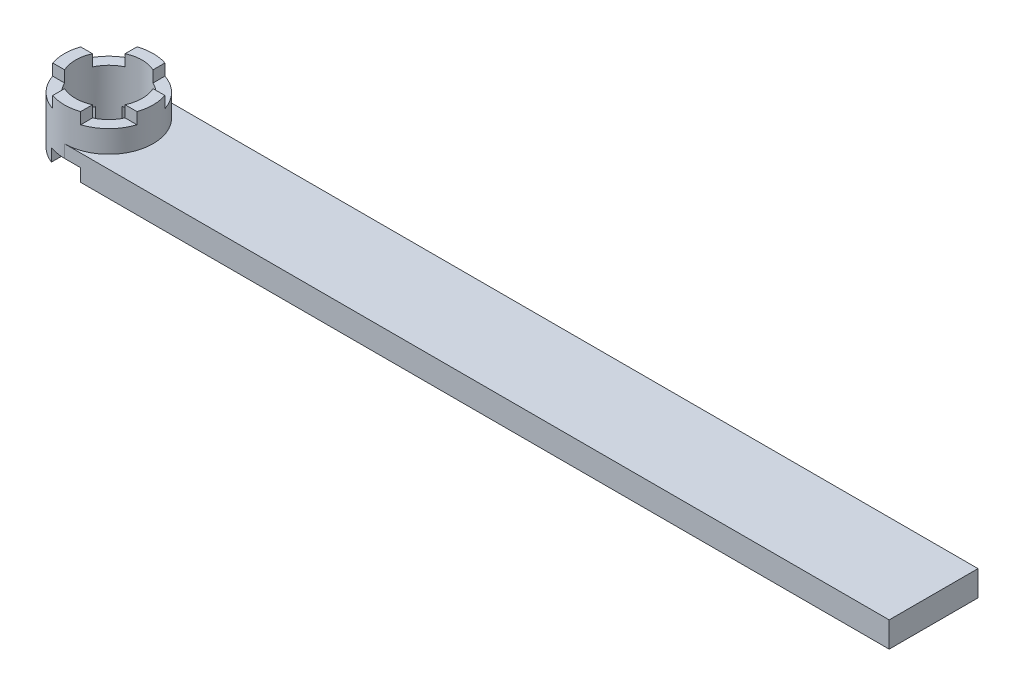
ISO-10303-21;
HEADER;
FILE_DESCRIPTION(('STEP AP214'),'2;1');
FILE_NAME('part.step','',(''),(''),'','','');
FILE_SCHEMA(('AUTOMOTIVE_DESIGN { 1 0 10303 214 1 1 1 1 }'));
ENDSEC;
DATA;
#1=APPLICATION_CONTEXT('core data for automotive mechanical design processes');
#2=APPLICATION_PROTOCOL_DEFINITION('international standard','automotive_design',2000,#1);
#3=PRODUCT_CONTEXT('',#1,'mechanical');
#4=PRODUCT('Part','Part','',(#3));
#5=PRODUCT_RELATED_PRODUCT_CATEGORY('part','',(#4));
#6=PRODUCT_DEFINITION_FORMATION('','',#4);
#7=PRODUCT_DEFINITION_CONTEXT('part definition',#1,'design');
#8=PRODUCT_DEFINITION('design','',#6,#7);
#9=PRODUCT_DEFINITION_SHAPE('','',#8);
#10=(LENGTH_UNIT() NAMED_UNIT(*) SI_UNIT(.MILLI.,.METRE.));
#11=(NAMED_UNIT(*) PLANE_ANGLE_UNIT() SI_UNIT($,.RADIAN.));
#12=(NAMED_UNIT(*) SI_UNIT($,.STERADIAN.) SOLID_ANGLE_UNIT());
#13=UNCERTAINTY_MEASURE_WITH_UNIT(LENGTH_MEASURE(1.E-05),#10,'distance_accuracy_value','');
#14=(GEOMETRIC_REPRESENTATION_CONTEXT(3) GLOBAL_UNCERTAINTY_ASSIGNED_CONTEXT((#13)) GLOBAL_UNIT_ASSIGNED_CONTEXT((#10,
#11,#12)) REPRESENTATION_CONTEXT('',''));
#15=CARTESIAN_POINT('',(0.,0.,0.));
#16=DIRECTION('',(0.,0.,1.));
#17=DIRECTION('',(1.,0.,0.));
#18=AXIS2_PLACEMENT_3D('',#15,#16,#17);
#19=CARTESIAN_POINT('',(0.,7.5,0.));
#20=DIRECTION('',(0.,1.,0.));
#21=DIRECTION('',(0.,0.,1.));
#22=AXIS2_PLACEMENT_3D('',#19,#20,#21);
#23=PLANE('',#22);
#24=CARTESIAN_POINT('',(0.,7.5,0.));
#25=DIRECTION('',(0.,1.,0.));
#26=DIRECTION('',(0.,0.,1.));
#27=AXIS2_PLACEMENT_3D('',#24,#25,#26);
#28=CIRCLE('',#27,7.);
#29=CARTESIAN_POINT('',(-2.2,7.5,-6.64529909033446));
#30=VERTEX_POINT('',#29);
#31=CARTESIAN_POINT('',(-6.64529909033446,7.5,-2.2));
#32=VERTEX_POINT('',#31);
#33=EDGE_CURVE('E718',#30,#32,#28,.T.);
#34=ORIENTED_EDGE('',*,*,#33,.T.);
#35=DIRECTION('',(1.,0.,0.));
#36=VECTOR('',#35,1.);
#37=CARTESIAN_POINT('',(0.,7.5,-2.2));
#38=LINE('',#37,#36);
#39=CARTESIAN_POINT('',(-4.76681235208604,7.5,-2.2));
#40=VERTEX_POINT('',#39);
#41=EDGE_CURVE('E297',#32,#40,#38,.T.);
#42=ORIENTED_EDGE('',*,*,#41,.T.);
#43=CARTESIAN_POINT('',(0.,7.5,0.));
#44=DIRECTION('',(0.,1.,0.));
#45=DIRECTION('',(0.,0.,1.));
#46=AXIS2_PLACEMENT_3D('',#43,#44,#45);
#47=CIRCLE('',#46,5.25);
#48=CARTESIAN_POINT('',(-2.2,7.5,-4.76681235208604));
#49=VERTEX_POINT('',#48);
#50=EDGE_CURVE('E691',#49,#40,#47,.T.);
#51=ORIENTED_EDGE('',*,*,#50,.F.);
#52=DIRECTION('',(0.,0.,-1.));
#53=VECTOR('',#52,1.);
#54=CARTESIAN_POINT('',(-2.2,7.5,0.));
#55=LINE('',#54,#53);
#56=EDGE_CURVE('E344',#49,#30,#55,.T.);
#57=ORIENTED_EDGE('',*,*,#56,.T.);
#58=EDGE_LOOP('',(#34,#42,#51,#57));
#59=FACE_BOUND('',#58,.T.);
#60=ADVANCED_FACE('F52',(#59),#23,.T.);
#61=CARTESIAN_POINT('',(-4.76681235208604,7.5,2.2));
#62=VERTEX_POINT('',#61);
#63=CARTESIAN_POINT('',(-2.2,7.5,4.76681235208604));
#64=VERTEX_POINT('',#63);
#65=EDGE_CURVE('E553',#62,#64,#47,.T.);
#66=ORIENTED_EDGE('',*,*,#65,.F.);
#67=DIRECTION('',(-1.,0.,0.));
#68=VECTOR('',#67,1.);
#69=CARTESIAN_POINT('',(0.,7.5,2.2));
#70=LINE('',#69,#68);
#71=CARTESIAN_POINT('',(-6.64529909033446,7.5,2.2));
#72=VERTEX_POINT('',#71);
#73=EDGE_CURVE('E319',#62,#72,#70,.T.);
#74=ORIENTED_EDGE('',*,*,#73,.T.);
#75=CARTESIAN_POINT('',(-2.2,7.5,6.64529909033446));
#76=VERTEX_POINT('',#75);
#77=EDGE_CURVE('E560',#72,#76,#28,.T.);
#78=ORIENTED_EDGE('',*,*,#77,.T.);
#79=DIRECTION('',(0.,0.,-1.));
#80=VECTOR('',#79,1.);
#81=CARTESIAN_POINT('',(-2.2,7.5,0.));
#82=LINE('',#81,#80);
#83=EDGE_CURVE('E420',#76,#64,#82,.T.);
#84=ORIENTED_EDGE('',*,*,#83,.T.);
#85=EDGE_LOOP('',(#66,#74,#78,#84));
#86=FACE_BOUND('',#85,.T.);
#87=ADVANCED_FACE('F724',(#86),#23,.T.);
#88=CARTESIAN_POINT('',(6.64529909033446,7.5,-2.2));
#89=VERTEX_POINT('',#88);
#90=CARTESIAN_POINT('',(2.2,7.5,-6.64529909033446));
#91=VERTEX_POINT('',#90);
#92=EDGE_CURVE('E559',#89,#91,#28,.T.);
#93=ORIENTED_EDGE('',*,*,#92,.T.);
#94=DIRECTION('',(0.,0.,1.));
#95=VECTOR('',#94,1.);
#96=CARTESIAN_POINT('',(2.2,7.5,0.));
#97=LINE('',#96,#95);
#98=CARTESIAN_POINT('',(2.2,7.5,-4.76681235208604));
#99=VERTEX_POINT('',#98);
#100=EDGE_CURVE('E354',#91,#99,#97,.T.);
#101=ORIENTED_EDGE('',*,*,#100,.T.);
#102=CARTESIAN_POINT('',(4.76681235208604,7.5,-2.2));
#103=VERTEX_POINT('',#102);
#104=EDGE_CURVE('E552',#103,#99,#47,.T.);
#105=ORIENTED_EDGE('',*,*,#104,.F.);
#106=DIRECTION('',(1.,0.,0.));
#107=VECTOR('',#106,1.);
#108=CARTESIAN_POINT('',(0.,7.5,-2.2));
#109=LINE('',#108,#107);
#110=EDGE_CURVE('E375',#103,#89,#109,.T.);
#111=ORIENTED_EDGE('',*,*,#110,.T.);
#112=EDGE_LOOP('',(#93,#101,#105,#111));
#113=FACE_BOUND('',#112,.T.);
#114=ADVANCED_FACE('F706',(#113),#23,.T.);
#115=CARTESIAN_POINT('',(2.2,7.5,6.64529909033446));
#116=VERTEX_POINT('',#115);
#117=CARTESIAN_POINT('',(6.64529909033446,7.5,2.2));
#118=VERTEX_POINT('',#117);
#119=EDGE_CURVE('E554',#116,#118,#28,.T.);
#120=ORIENTED_EDGE('',*,*,#119,.T.);
#121=DIRECTION('',(-1.,0.,0.));
#122=VECTOR('',#121,1.);
#123=CARTESIAN_POINT('',(0.,7.5,2.2));
#124=LINE('',#123,#122);
#125=CARTESIAN_POINT('',(4.76681235208604,7.5,2.2));
#126=VERTEX_POINT('',#125);
#127=EDGE_CURVE('E386',#118,#126,#124,.T.);
#128=ORIENTED_EDGE('',*,*,#127,.T.);
#129=CARTESIAN_POINT('',(2.2,7.5,4.76681235208604));
#130=VERTEX_POINT('',#129);
#131=EDGE_CURVE('E547',#130,#126,#47,.T.);
#132=ORIENTED_EDGE('',*,*,#131,.F.);
#133=DIRECTION('',(0.,0.,1.));
#134=VECTOR('',#133,1.);
#135=CARTESIAN_POINT('',(2.2,7.5,0.));
#136=LINE('',#135,#134);
#137=EDGE_CURVE('E409',#130,#116,#136,.T.);
#138=ORIENTED_EDGE('',*,*,#137,.T.);
#139=EDGE_LOOP('',(#120,#128,#132,#138));
#140=FACE_BOUND('',#139,.T.);
#141=ADVANCED_FACE('F740',(#140),#23,.T.);
#142=CARTESIAN_POINT('',(0.,4.,-7.));
#143=DIRECTION('',(0.,0.,-1.));
#144=DIRECTION('',(-1.,0.,0.));
#145=AXIS2_PLACEMENT_3D('',#142,#143,#144);
#146=PLANE('',#145);
#147=DIRECTION('',(1.,0.,0.));
#148=VECTOR('',#147,1.);
#149=CARTESIAN_POINT('',(0.,0.,-7.));
#150=LINE('',#149,#148);
#151=CARTESIAN_POINT('',(2.5,0.,-7.));
#152=VERTEX_POINT('',#151);
#153=CARTESIAN_POINT('',(130.,0.,-7.));
#154=VERTEX_POINT('',#153);
#155=EDGE_CURVE('E558',#152,#154,#150,.T.);
#156=ORIENTED_EDGE('',*,*,#155,.F.);
#157=DIRECTION('',(0.,1.,0.));
#158=VECTOR('',#157,1.);
#159=CARTESIAN_POINT('',(2.5,4.,-7.));
#160=LINE('',#159,#158);
#161=CARTESIAN_POINT('',(2.5,2.,-7.));
#162=VERTEX_POINT('',#161);
#163=EDGE_CURVE('E528',#152,#162,#160,.T.);
#164=ORIENTED_EDGE('',*,*,#163,.T.);
#165=DIRECTION('',(-1.,0.,0.));
#166=VECTOR('',#165,1.);
#167=CARTESIAN_POINT('',(0.,2.,-7.));
#168=LINE('',#167,#166);
#169=CARTESIAN_POINT('',(0.,2.,-7.));
#170=VERTEX_POINT('',#169);
#171=EDGE_CURVE('E543',#162,#170,#168,.T.);
#172=ORIENTED_EDGE('',*,*,#171,.T.);
#173=DIRECTION('',(0.,-1.,0.));
#174=VECTOR('',#173,1.);
#175=CARTESIAN_POINT('',(0.,4.,-7.));
#176=LINE('',#175,#174);
#177=CARTESIAN_POINT('',(0.,4.,-7.));
#178=VERTEX_POINT('',#177);
#179=EDGE_CURVE('E607',#178,#170,#176,.T.);
#180=ORIENTED_EDGE('',*,*,#179,.F.);
#181=DIRECTION('',(1.,0.,0.));
#182=VECTOR('',#181,1.);
#183=CARTESIAN_POINT('',(0.,4.,-7.));
#184=LINE('',#183,#182);
#185=CARTESIAN_POINT('',(130.,4.,-7.));
#186=VERTEX_POINT('',#185);
#187=EDGE_CURVE('E564',#178,#186,#184,.T.);
#188=ORIENTED_EDGE('',*,*,#187,.T.);
#189=DIRECTION('',(0.,-1.,0.));
#190=VECTOR('',#189,1.);
#191=CARTESIAN_POINT('',(130.,4.,-7.));
#192=LINE('',#191,#190);
#193=EDGE_CURVE('E576',#186,#154,#192,.T.);
#194=ORIENTED_EDGE('',*,*,#193,.T.);
#195=EDGE_LOOP('',(#156,#164,#172,#180,#188,#194));
#196=FACE_BOUND('',#195,.T.);
#197=ADVANCED_FACE('F54',(#196),#146,.T.);
#198=CARTESIAN_POINT('',(0.,4.,0.));
#199=DIRECTION('',(0.,-1.,0.));
#200=DIRECTION('',(0.,0.,-1.));
#201=AXIS2_PLACEMENT_3D('',#198,#199,#200);
#202=CYLINDRICAL_SURFACE('',#201,7.);
#203=ORIENTED_EDGE('',*,*,#119,.F.);
#204=DIRECTION('',(0.,-1.,0.));
#205=VECTOR('',#204,1.);
#206=CARTESIAN_POINT('',(2.2,9.3,6.64529909033446));
#207=LINE('',#206,#205);
#208=CARTESIAN_POINT('',(2.2,9.3,6.64529909033446));
#209=VERTEX_POINT('',#208);
#210=EDGE_CURVE('E432',#209,#116,#207,.T.);
#211=ORIENTED_EDGE('',*,*,#210,.F.);
#212=CARTESIAN_POINT('',(0.,9.3,0.));
#213=DIRECTION('',(0.,1.,0.));
#214=DIRECTION('',(0.,0.,1.));
#215=AXIS2_PLACEMENT_3D('',#212,#213,#214);
#216=CIRCLE('',#215,7.);
#217=CARTESIAN_POINT('',(-2.2,9.3,6.64529909033446));
#218=VERTEX_POINT('',#217);
#219=EDGE_CURVE('E408',#218,#209,#216,.T.);
#220=ORIENTED_EDGE('',*,*,#219,.F.);
#221=DIRECTION('',(0.,-1.,0.));
#222=VECTOR('',#221,1.);
#223=CARTESIAN_POINT('',(-2.2,9.3,6.64529909033446));
#224=LINE('',#223,#222);
#225=EDGE_CURVE('E390',#218,#76,#224,.T.);
#226=ORIENTED_EDGE('',*,*,#225,.T.);
#227=ORIENTED_EDGE('',*,*,#77,.F.);
#228=DIRECTION('',(0.,-1.,0.));
#229=VECTOR('',#228,1.);
#230=CARTESIAN_POINT('',(-6.64529909033446,9.3,2.2));
#231=LINE('',#230,#229);
#232=CARTESIAN_POINT('',(-6.64529909033446,9.3,2.2));
#233=VERTEX_POINT('',#232);
#234=EDGE_CURVE('E69',#233,#72,#231,.T.);
#235=ORIENTED_EDGE('',*,*,#234,.F.);
#236=CARTESIAN_POINT('',(0.,9.3,0.));
#237=DIRECTION('',(0.,1.,0.));
#238=DIRECTION('',(0.,0.,1.));
#239=AXIS2_PLACEMENT_3D('',#236,#237,#238);
#240=CIRCLE('',#239,7.);
#241=CARTESIAN_POINT('',(-6.64529909033446,9.3,-2.2));
#242=VERTEX_POINT('',#241);
#243=EDGE_CURVE('E304',#242,#233,#240,.T.);
#244=ORIENTED_EDGE('',*,*,#243,.F.);
#245=DIRECTION('',(0.,-1.,0.));
#246=VECTOR('',#245,1.);
#247=CARTESIAN_POINT('',(-6.64529909033446,9.3,-2.2));
#248=LINE('',#247,#246);
#249=EDGE_CURVE('E291',#242,#32,#248,.T.);
#250=ORIENTED_EDGE('',*,*,#249,.T.);
#251=ORIENTED_EDGE('',*,*,#33,.F.);
#252=DIRECTION('',(0.,-1.,0.));
#253=VECTOR('',#252,1.);
#254=CARTESIAN_POINT('',(-2.2,9.3,-6.64529909033446));
#255=LINE('',#254,#253);
#256=CARTESIAN_POINT('',(-2.2,9.3,-6.64529909033446));
#257=VERTEX_POINT('',#256);
#258=EDGE_CURVE('E77',#257,#30,#255,.T.);
#259=ORIENTED_EDGE('',*,*,#258,.F.);
#260=CARTESIAN_POINT('',(0.,9.3,0.));
#261=DIRECTION('',(0.,1.,0.));
#262=DIRECTION('',(0.,0.,1.));
#263=AXIS2_PLACEMENT_3D('',#260,#261,#262);
#264=CIRCLE('',#263,7.);
#265=CARTESIAN_POINT('',(2.2,9.3,-6.64529909033446));
#266=VERTEX_POINT('',#265);
#267=EDGE_CURVE('E343',#266,#257,#264,.T.);
#268=ORIENTED_EDGE('',*,*,#267,.F.);
#269=DIRECTION('',(0.,-1.,0.));
#270=VECTOR('',#269,1.);
#271=CARTESIAN_POINT('',(2.2,9.3,-6.64529909033446));
#272=LINE('',#271,#270);
#273=EDGE_CURVE('E330',#266,#91,#272,.T.);
#274=ORIENTED_EDGE('',*,*,#273,.T.);
#275=ORIENTED_EDGE('',*,*,#92,.F.);
#276=DIRECTION('',(0.,-1.,0.));
#277=VECTOR('',#276,1.);
#278=CARTESIAN_POINT('',(6.64529909033446,9.3,-2.2));
#279=LINE('',#278,#277);
#280=CARTESIAN_POINT('',(6.64529909033446,9.3,-2.2));
#281=VERTEX_POINT('',#280);
#282=EDGE_CURVE('E399',#281,#89,#279,.T.);
#283=ORIENTED_EDGE('',*,*,#282,.F.);
#284=CARTESIAN_POINT('',(0.,9.3,0.));
#285=DIRECTION('',(0.,1.,0.));
#286=DIRECTION('',(0.,0.,1.));
#287=AXIS2_PLACEMENT_3D('',#284,#285,#286);
#288=CIRCLE('',#287,7.);
#289=CARTESIAN_POINT('',(6.64529909033446,9.3,2.2));
#290=VERTEX_POINT('',#289);
#291=EDGE_CURVE('E374',#290,#281,#288,.T.);
#292=ORIENTED_EDGE('',*,*,#291,.F.);
#293=DIRECTION('',(0.,-1.,0.));
#294=VECTOR('',#293,1.);
#295=CARTESIAN_POINT('',(6.64529909033446,9.3,2.2));
#296=LINE('',#295,#294);
#297=EDGE_CURVE('E358',#290,#118,#296,.T.);
#298=ORIENTED_EDGE('',*,*,#297,.T.);
#299=EDGE_LOOP('',(#203,#211,#220,#226,#227,#235,#244,#250,#251,#259,#268,#274,#275,#283,#292,#298));
#300=FACE_BOUND('',#299,.T.);
#301=DIRECTION('',(0.,-1.,0.));
#302=VECTOR('',#301,1.);
#303=CARTESIAN_POINT('',(-2.5,4.,6.53834841531101));
#304=LINE('',#303,#302);
#305=CARTESIAN_POINT('',(-2.5,2.,6.53834841531101));
#306=VERTEX_POINT('',#305);
#307=CARTESIAN_POINT('',(-2.5,0.,6.53834841531101));
#308=VERTEX_POINT('',#307);
#309=EDGE_CURVE('E500',#306,#308,#304,.T.);
#310=ORIENTED_EDGE('',*,*,#309,.F.);
#311=CARTESIAN_POINT('',(0.,2.,0.));
#312=DIRECTION('',(0.,-1.,0.));
#313=DIRECTION('',(0.,0.,-1.));
#314=AXIS2_PLACEMENT_3D('',#311,#312,#313);
#315=CIRCLE('',#314,7.);
#316=CARTESIAN_POINT('',(0.,2.,7.));
#317=VERTEX_POINT('',#316);
#318=EDGE_CURVE('E538',#317,#306,#315,.T.);
#319=ORIENTED_EDGE('',*,*,#318,.F.);
#320=DIRECTION('',(0.,-1.,0.));
#321=VECTOR('',#320,1.);
#322=CARTESIAN_POINT('',(0.,4.,7.));
#323=LINE('',#322,#321);
#324=CARTESIAN_POINT('',(0.,4.,7.));
#325=VERTEX_POINT('',#324);
#326=EDGE_CURVE('E603',#325,#317,#323,.T.);
#327=ORIENTED_EDGE('',*,*,#326,.F.);
#328=CARTESIAN_POINT('',(0.,4.,0.));
#329=DIRECTION('',(0.,1.,0.));
#330=DIRECTION('',(0.,0.,1.));
#331=AXIS2_PLACEMENT_3D('',#328,#329,#330);
#332=CIRCLE('',#331,7.);
#333=EDGE_CURVE('E551',#325,#178,#332,.T.);
#334=ORIENTED_EDGE('',*,*,#333,.T.);
#335=ORIENTED_EDGE('',*,*,#179,.T.);
#336=CARTESIAN_POINT('',(-2.5,2.,-6.53834841531101));
#337=VERTEX_POINT('',#336);
#338=EDGE_CURVE('E541',#337,#170,#315,.T.);
#339=ORIENTED_EDGE('',*,*,#338,.F.);
#340=DIRECTION('',(0.,-1.,0.));
#341=VECTOR('',#340,1.);
#342=CARTESIAN_POINT('',(-2.5,4.,-6.53834841531101));
#343=LINE('',#342,#341);
#344=CARTESIAN_POINT('',(-2.5,0.,-6.53834841531101));
#345=VERTEX_POINT('',#344);
#346=EDGE_CURVE('E520',#337,#345,#343,.T.);
#347=ORIENTED_EDGE('',*,*,#346,.T.);
#348=CARTESIAN_POINT('',(0.,0.,0.));
#349=DIRECTION('',(0.,1.,0.));
#350=DIRECTION('',(0.,0.,1.));
#351=AXIS2_PLACEMENT_3D('',#348,#349,#350);
#352=CIRCLE('',#351,7.);
#353=CARTESIAN_POINT('',(-6.53834841531101,0.,-2.5));
#354=VERTEX_POINT('',#353);
#355=EDGE_CURVE('E583',#345,#354,#352,.T.);
#356=ORIENTED_EDGE('',*,*,#355,.T.);
#357=DIRECTION('',(0.,-1.,0.));
#358=VECTOR('',#357,1.);
#359=CARTESIAN_POINT('',(-6.53834841531101,4.,-2.5));
#360=LINE('',#359,#358);
#361=CARTESIAN_POINT('',(-6.53834841531101,2.,-2.5));
#362=VERTEX_POINT('',#361);
#363=EDGE_CURVE('E513',#354,#362,#360,.F.);
#364=ORIENTED_EDGE('',*,*,#363,.T.);
#365=CARTESIAN_POINT('',(-6.53834841531101,2.,2.5));
#366=VERTEX_POINT('',#365);
#367=EDGE_CURVE('E542',#366,#362,#315,.T.);
#368=ORIENTED_EDGE('',*,*,#367,.F.);
#369=DIRECTION('',(0.,-1.,0.));
#370=VECTOR('',#369,1.);
#371=CARTESIAN_POINT('',(-6.53834841531101,4.,2.5));
#372=LINE('',#371,#370);
#373=CARTESIAN_POINT('',(-6.53834841531101,0.,2.5));
#374=VERTEX_POINT('',#373);
#375=EDGE_CURVE('E507',#374,#366,#372,.F.);
#376=ORIENTED_EDGE('',*,*,#375,.F.);
#377=EDGE_CURVE('E579',#374,#308,#352,.T.);
#378=ORIENTED_EDGE('',*,*,#377,.T.);
#379=EDGE_LOOP('',(#310,#319,#327,#334,#335,#339,#347,#356,#364,#368,#376,#378));
#380=FACE_BOUND('',#379,.T.);
#381=ADVANCED_FACE('F306',(#300,#380),#202,.T.);
#382=CARTESIAN_POINT('',(0.,4.,0.));
#383=DIRECTION('',(0.,-1.,0.));
#384=DIRECTION('',(0.,0.,-1.));
#385=AXIS2_PLACEMENT_3D('',#382,#383,#384);
#386=CYLINDRICAL_SURFACE('',#385,5.25);
#387=DIRECTION('',(0.,-1.,0.));
#388=VECTOR('',#387,1.);
#389=CARTESIAN_POINT('',(4.61654632815485,4.,-2.5));
#390=LINE('',#389,#388);
#391=CARTESIAN_POINT('',(4.61654632815485,2.,-2.5));
#392=VERTEX_POINT('',#391);
#393=CARTESIAN_POINT('',(4.61654632815485,0.,-2.5));
#394=VERTEX_POINT('',#393);
#395=EDGE_CURVE('E532',#392,#394,#390,.T.);
#396=ORIENTED_EDGE('',*,*,#395,.F.);
#397=CARTESIAN_POINT('',(0.,2.,0.));
#398=DIRECTION('',(0.,-1.,0.));
#399=DIRECTION('',(0.,0.,-1.));
#400=AXIS2_PLACEMENT_3D('',#397,#398,#399);
#401=CIRCLE('',#400,5.25);
#402=CARTESIAN_POINT('',(4.61654632815485,2.,2.5));
#403=VERTEX_POINT('',#402);
#404=EDGE_CURVE('E12',#392,#403,#401,.T.);
#405=ORIENTED_EDGE('',*,*,#404,.T.);
#406=DIRECTION('',(0.,-1.,0.));
#407=VECTOR('',#406,1.);
#408=CARTESIAN_POINT('',(4.61654632815485,4.,2.5));
#409=LINE('',#408,#407);
#410=CARTESIAN_POINT('',(4.61654632815485,0.,2.5));
#411=VERTEX_POINT('',#410);
#412=EDGE_CURVE('E486',#411,#403,#409,.F.);
#413=ORIENTED_EDGE('',*,*,#412,.F.);
#414=CARTESIAN_POINT('',(0.,0.,0.));
#415=DIRECTION('',(0.,1.,0.));
#416=DIRECTION('',(0.,0.,1.));
#417=AXIS2_PLACEMENT_3D('',#414,#415,#416);
#418=CIRCLE('',#417,5.25);
#419=CARTESIAN_POINT('',(2.5,0.,4.61654632815485));
#420=VERTEX_POINT('',#419);
#421=EDGE_CURVE('E569',#420,#411,#418,.T.);
#422=ORIENTED_EDGE('',*,*,#421,.F.);
#423=DIRECTION('',(0.,-1.,0.));
#424=VECTOR('',#423,1.);
#425=CARTESIAN_POINT('',(2.5,4.,4.61654632815485));
#426=LINE('',#425,#424);
#427=CARTESIAN_POINT('',(2.5,2.,4.61654632815485));
#428=VERTEX_POINT('',#427);
#429=EDGE_CURVE('E489',#428,#420,#426,.T.);
#430=ORIENTED_EDGE('',*,*,#429,.F.);
#431=CARTESIAN_POINT('',(-2.5,2.,4.61654632815485));
#432=VERTEX_POINT('',#431);
#433=EDGE_CURVE('E62',#428,#432,#401,.T.);
#434=ORIENTED_EDGE('',*,*,#433,.T.);
#435=DIRECTION('',(0.,-1.,0.));
#436=VECTOR('',#435,1.);
#437=CARTESIAN_POINT('',(-2.5,4.,4.61654632815485));
#438=LINE('',#437,#436);
#439=CARTESIAN_POINT('',(-2.5,0.,4.61654632815485));
#440=VERTEX_POINT('',#439);
#441=EDGE_CURVE('E496',#432,#440,#438,.T.);
#442=ORIENTED_EDGE('',*,*,#441,.T.);
#443=CARTESIAN_POINT('',(-4.61654632815485,0.,2.5));
#444=VERTEX_POINT('',#443);
#445=EDGE_CURVE('E591',#444,#440,#418,.T.);
#446=ORIENTED_EDGE('',*,*,#445,.F.);
#447=DIRECTION('',(0.,-1.,0.));
#448=VECTOR('',#447,1.);
#449=CARTESIAN_POINT('',(-4.61654632815485,4.,2.5));
#450=LINE('',#449,#448);
#451=CARTESIAN_POINT('',(-4.61654632815485,2.,2.5));
#452=VERTEX_POINT('',#451);
#453=EDGE_CURVE('E503',#444,#452,#450,.F.);
#454=ORIENTED_EDGE('',*,*,#453,.T.);
#455=CARTESIAN_POINT('',(-4.61654632815485,2.,-2.5));
#456=VERTEX_POINT('',#455);
#457=EDGE_CURVE('E638',#452,#456,#401,.T.);
#458=ORIENTED_EDGE('',*,*,#457,.T.);
#459=DIRECTION('',(0.,-1.,0.));
#460=VECTOR('',#459,1.);
#461=CARTESIAN_POINT('',(-4.61654632815485,4.,-2.5));
#462=LINE('',#461,#460);
#463=CARTESIAN_POINT('',(-4.61654632815485,0.,-2.5));
#464=VERTEX_POINT('',#463);
#465=EDGE_CURVE('E510',#464,#456,#462,.F.);
#466=ORIENTED_EDGE('',*,*,#465,.F.);
#467=CARTESIAN_POINT('',(-2.5,0.,-4.61654632815485));
#468=VERTEX_POINT('',#467);
#469=EDGE_CURVE('E968',#468,#464,#418,.T.);
#470=ORIENTED_EDGE('',*,*,#469,.F.);
#471=DIRECTION('',(0.,-1.,0.));
#472=VECTOR('',#471,1.);
#473=CARTESIAN_POINT('',(-2.5,4.,-4.61654632815485));
#474=LINE('',#473,#472);
#475=CARTESIAN_POINT('',(-2.5,2.,-4.61654632815485));
#476=VERTEX_POINT('',#475);
#477=EDGE_CURVE('E517',#476,#468,#474,.T.);
#478=ORIENTED_EDGE('',*,*,#477,.F.);
#479=CARTESIAN_POINT('',(2.5,2.,-4.61654632815485));
#480=VERTEX_POINT('',#479);
#481=EDGE_CURVE('E56',#476,#480,#401,.T.);
#482=ORIENTED_EDGE('',*,*,#481,.T.);
#483=DIRECTION('',(0.,-1.,0.));
#484=VECTOR('',#483,1.);
#485=CARTESIAN_POINT('',(2.5,4.,-4.61654632815485));
#486=LINE('',#485,#484);
#487=CARTESIAN_POINT('',(2.5,0.,-4.61654632815485));
#488=VERTEX_POINT('',#487);
#489=EDGE_CURVE('E524',#480,#488,#486,.T.);
#490=ORIENTED_EDGE('',*,*,#489,.T.);
#491=EDGE_CURVE('E595',#394,#488,#418,.T.);
#492=ORIENTED_EDGE('',*,*,#491,.F.);
#493=EDGE_LOOP('',(#396,#405,#413,#422,#430,#434,#442,#446,#454,#458,#466,#470,#478,#482,#490,#492));
#494=FACE_BOUND('',#493,.T.);
#495=ORIENTED_EDGE('',*,*,#131,.T.);
#496=DIRECTION('',(0.,-1.,0.));
#497=VECTOR('',#496,1.);
#498=CARTESIAN_POINT('',(4.76681235208604,9.3,2.2));
#499=LINE('',#498,#497);
#500=CARTESIAN_POINT('',(4.76681235208604,9.3,2.2));
#501=VERTEX_POINT('',#500);
#502=EDGE_CURVE('E385',#501,#126,#499,.T.);
#503=ORIENTED_EDGE('',*,*,#502,.F.);
#504=CARTESIAN_POINT('',(0.,9.3,0.));
#505=DIRECTION('',(0.,1.,0.));
#506=DIRECTION('',(0.,0.,1.));
#507=AXIS2_PLACEMENT_3D('',#504,#505,#506);
#508=CIRCLE('',#507,5.25);
#509=CARTESIAN_POINT('',(4.76681235208604,9.3,-2.2));
#510=VERTEX_POINT('',#509);
#511=EDGE_CURVE('E382',#510,#501,#508,.F.);
#512=ORIENTED_EDGE('',*,*,#511,.F.);
#513=DIRECTION('',(0.,-1.,0.));
#514=VECTOR('',#513,1.);
#515=CARTESIAN_POINT('',(4.76681235208604,9.3,-2.2));
#516=LINE('',#515,#514);
#517=EDGE_CURVE('E396',#510,#103,#516,.T.);
#518=ORIENTED_EDGE('',*,*,#517,.T.);
#519=ORIENTED_EDGE('',*,*,#104,.T.);
#520=DIRECTION('',(0.,-1.,0.));
#521=VECTOR('',#520,1.);
#522=CARTESIAN_POINT('',(2.2,9.3,-4.76681235208604));
#523=LINE('',#522,#521);
#524=CARTESIAN_POINT('',(2.2,9.3,-4.76681235208604));
#525=VERTEX_POINT('',#524);
#526=EDGE_CURVE('E353',#525,#99,#523,.T.);
#527=ORIENTED_EDGE('',*,*,#526,.F.);
#528=CARTESIAN_POINT('',(0.,9.3,0.));
#529=DIRECTION('',(0.,1.,0.));
#530=DIRECTION('',(0.,0.,1.));
#531=AXIS2_PLACEMENT_3D('',#528,#529,#530);
#532=CIRCLE('',#531,5.25);
#533=CARTESIAN_POINT('',(-2.2,9.3,-4.76681235208604));
#534=VERTEX_POINT('',#533);
#535=EDGE_CURVE('E350',#534,#525,#532,.F.);
#536=ORIENTED_EDGE('',*,*,#535,.F.);
#537=DIRECTION('',(0.,-1.,0.));
#538=VECTOR('',#537,1.);
#539=CARTESIAN_POINT('',(-2.2,9.3,-4.76681235208604));
#540=LINE('',#539,#538);
#541=EDGE_CURVE('E363',#534,#49,#540,.T.);
#542=ORIENTED_EDGE('',*,*,#541,.T.);
#543=ORIENTED_EDGE('',*,*,#50,.T.);
#544=DIRECTION('',(0.,-1.,0.));
#545=VECTOR('',#544,1.);
#546=CARTESIAN_POINT('',(-4.76681235208604,9.3,-2.2));
#547=LINE('',#546,#545);
#548=CARTESIAN_POINT('',(-4.76681235208604,9.3,-2.2));
#549=VERTEX_POINT('',#548);
#550=EDGE_CURVE('E328',#549,#40,#547,.T.);
#551=ORIENTED_EDGE('',*,*,#550,.F.);
#552=CARTESIAN_POINT('',(0.,9.3,0.));
#553=DIRECTION('',(0.,1.,0.));
#554=DIRECTION('',(0.,0.,1.));
#555=AXIS2_PLACEMENT_3D('',#552,#553,#554);
#556=CIRCLE('',#555,5.25);
#557=CARTESIAN_POINT('',(-4.76681235208604,9.3,2.2));
#558=VERTEX_POINT('',#557);
#559=EDGE_CURVE('E316',#558,#549,#556,.F.);
#560=ORIENTED_EDGE('',*,*,#559,.F.);
#561=DIRECTION('',(0.,-1.,0.));
#562=VECTOR('',#561,1.);
#563=CARTESIAN_POINT('',(-4.76681235208604,9.3,2.2));
#564=LINE('',#563,#562);
#565=EDGE_CURVE('E334',#558,#62,#564,.T.);
#566=ORIENTED_EDGE('',*,*,#565,.T.);
#567=ORIENTED_EDGE('',*,*,#65,.T.);
#568=DIRECTION('',(0.,-1.,0.));
#569=VECTOR('',#568,1.);
#570=CARTESIAN_POINT('',(-2.2,9.3,4.76681235208604));
#571=LINE('',#570,#569);
#572=CARTESIAN_POINT('',(-2.2,9.3,4.76681235208604));
#573=VERTEX_POINT('',#572);
#574=EDGE_CURVE('E419',#573,#64,#571,.T.);
#575=ORIENTED_EDGE('',*,*,#574,.F.);
#576=CARTESIAN_POINT('',(0.,9.3,0.));
#577=DIRECTION('',(0.,1.,0.));
#578=DIRECTION('',(0.,0.,1.));
#579=AXIS2_PLACEMENT_3D('',#576,#577,#578);
#580=CIRCLE('',#579,5.25);
#581=CARTESIAN_POINT('',(2.2,9.3,4.76681235208604));
#582=VERTEX_POINT('',#581);
#583=EDGE_CURVE('E416',#582,#573,#580,.F.);
#584=ORIENTED_EDGE('',*,*,#583,.F.);
#585=DIRECTION('',(0.,-1.,0.));
#586=VECTOR('',#585,1.);
#587=CARTESIAN_POINT('',(2.2,9.3,4.76681235208604));
#588=LINE('',#587,#586);
#589=EDGE_CURVE('E429',#582,#130,#588,.T.);
#590=ORIENTED_EDGE('',*,*,#589,.T.);
#591=EDGE_LOOP('',(#495,#503,#512,#518,#519,#527,#536,#542,#543,#551,#560,#566,#567,#575,#584,#590));
#592=FACE_BOUND('',#591,.T.);
#593=ADVANCED_FACE('F648',(#494,#592),#386,.F.);
#594=CARTESIAN_POINT('',(0.,0.,0.));
#595=DIRECTION('',(0.,1.,0.));
#596=DIRECTION('',(0.,0.,1.));
#597=AXIS2_PLACEMENT_3D('',#594,#595,#596);
#598=PLANE('',#597);
#599=DIRECTION('',(0.,0.,1.));
#600=VECTOR('',#599,1.);
#601=CARTESIAN_POINT('',(2.5,0.,0.));
#602=LINE('',#601,#600);
#603=EDGE_CURVE('E632',#152,#488,#602,.T.);
#604=ORIENTED_EDGE('',*,*,#603,.F.);
#605=ORIENTED_EDGE('',*,*,#155,.T.);
#606=DIRECTION('',(0.,0.,1.));
#607=VECTOR('',#606,1.);
#608=CARTESIAN_POINT('',(130.,0.,0.));
#609=LINE('',#608,#607);
#610=CARTESIAN_POINT('',(130.,0.,7.));
#611=VERTEX_POINT('',#610);
#612=EDGE_CURVE('E587',#154,#611,#609,.T.);
#613=ORIENTED_EDGE('',*,*,#612,.T.);
#614=DIRECTION('',(1.,0.,0.));
#615=VECTOR('',#614,1.);
#616=CARTESIAN_POINT('',(0.,0.,7.));
#617=LINE('',#616,#615);
#618=CARTESIAN_POINT('',(2.5,0.,7.));
#619=VERTEX_POINT('',#618);
#620=EDGE_CURVE('E584',#619,#611,#617,.T.);
#621=ORIENTED_EDGE('',*,*,#620,.F.);
#622=DIRECTION('',(0.,0.,-1.));
#623=VECTOR('',#622,1.);
#624=CARTESIAN_POINT('',(2.5,0.,0.));
#625=LINE('',#624,#623);
#626=EDGE_CURVE('E615',#619,#420,#625,.T.);
#627=ORIENTED_EDGE('',*,*,#626,.T.);
#628=ORIENTED_EDGE('',*,*,#421,.T.);
#629=DIRECTION('',(-1.,0.,0.));
#630=VECTOR('',#629,1.);
#631=CARTESIAN_POINT('',(8.,0.,2.5));
#632=LINE('',#631,#630);
#633=CARTESIAN_POINT('',(8.,0.,2.5));
#634=VERTEX_POINT('',#633);
#635=EDGE_CURVE('E442',#634,#411,#632,.T.);
#636=ORIENTED_EDGE('',*,*,#635,.F.);
#637=DIRECTION('',(0.,0.,-1.));
#638=VECTOR('',#637,1.);
#639=CARTESIAN_POINT('',(8.,0.,2.5));
#640=LINE('',#639,#638);
#641=CARTESIAN_POINT('',(8.,0.,-2.5));
#642=VERTEX_POINT('',#641);
#643=EDGE_CURVE('E302',#634,#642,#640,.T.);
#644=ORIENTED_EDGE('',*,*,#643,.T.);
#645=DIRECTION('',(-1.,0.,0.));
#646=VECTOR('',#645,1.);
#647=CARTESIAN_POINT('',(0.,0.,-2.5));
#648=LINE('',#647,#646);
#649=EDGE_CURVE('E611',#642,#394,#648,.T.);
#650=ORIENTED_EDGE('',*,*,#649,.T.);
#651=ORIENTED_EDGE('',*,*,#491,.T.);
#652=EDGE_LOOP('',(#604,#605,#613,#621,#627,#628,#636,#644,#650,#651));
#653=FACE_BOUND('',#652,.T.);
#654=ADVANCED_FACE('F665',(#653),#598,.F.);
#655=DIRECTION('',(-1.,0.,0.));
#656=VECTOR('',#655,1.);
#657=CARTESIAN_POINT('',(0.,0.,2.5));
#658=LINE('',#657,#656);
#659=EDGE_CURVE('E622',#444,#374,#658,.T.);
#660=ORIENTED_EDGE('',*,*,#659,.F.);
#661=ORIENTED_EDGE('',*,*,#445,.T.);
#662=DIRECTION('',(0.,0.,-1.));
#663=VECTOR('',#662,1.);
#664=CARTESIAN_POINT('',(-2.5,0.,0.));
#665=LINE('',#664,#663);
#666=EDGE_CURVE('E619',#308,#440,#665,.T.);
#667=ORIENTED_EDGE('',*,*,#666,.F.);
#668=ORIENTED_EDGE('',*,*,#377,.F.);
#669=EDGE_LOOP('',(#660,#661,#667,#668));
#670=FACE_BOUND('',#669,.T.);
#671=ADVANCED_FACE('F977',(#670),#598,.F.);
#672=ORIENTED_EDGE('',*,*,#355,.F.);
#673=DIRECTION('',(0.,0.,1.));
#674=VECTOR('',#673,1.);
#675=CARTESIAN_POINT('',(-2.5,0.,0.));
#676=LINE('',#675,#674);
#677=EDGE_CURVE('E629',#345,#468,#676,.T.);
#678=ORIENTED_EDGE('',*,*,#677,.T.);
#679=ORIENTED_EDGE('',*,*,#469,.T.);
#680=DIRECTION('',(-1.,0.,0.));
#681=VECTOR('',#680,1.);
#682=CARTESIAN_POINT('',(0.,0.,-2.5));
#683=LINE('',#682,#681);
#684=EDGE_CURVE('E625',#464,#354,#683,.T.);
#685=ORIENTED_EDGE('',*,*,#684,.T.);
#686=EDGE_LOOP('',(#672,#678,#679,#685));
#687=FACE_BOUND('',#686,.T.);
#688=ADVANCED_FACE('F980',(#687),#598,.F.);
#689=CARTESIAN_POINT('',(0.,4.,7.));
#690=DIRECTION('',(0.,0.,-1.));
#691=DIRECTION('',(-1.,0.,0.));
#692=AXIS2_PLACEMENT_3D('',#689,#690,#691);
#693=PLANE('',#692);
#694=DIRECTION('',(-1.,0.,0.));
#695=VECTOR('',#694,1.);
#696=CARTESIAN_POINT('',(0.,2.,7.));
#697=LINE('',#696,#695);
#698=CARTESIAN_POINT('',(2.5,2.,7.));
#699=VERTEX_POINT('',#698);
#700=EDGE_CURVE('E535',#699,#317,#697,.T.);
#701=ORIENTED_EDGE('',*,*,#700,.F.);
#702=DIRECTION('',(0.,-1.,0.));
#703=VECTOR('',#702,1.);
#704=CARTESIAN_POINT('',(2.5,4.,7.));
#705=LINE('',#704,#703);
#706=EDGE_CURVE('E492',#699,#619,#705,.T.);
#707=ORIENTED_EDGE('',*,*,#706,.T.);
#708=ORIENTED_EDGE('',*,*,#620,.T.);
#709=DIRECTION('',(0.,-1.,0.));
#710=VECTOR('',#709,1.);
#711=CARTESIAN_POINT('',(130.,4.,7.));
#712=LINE('',#711,#710);
#713=CARTESIAN_POINT('',(130.,4.,7.));
#714=VERTEX_POINT('',#713);
#715=EDGE_CURVE('E599',#714,#611,#712,.T.);
#716=ORIENTED_EDGE('',*,*,#715,.F.);
#717=DIRECTION('',(1.,0.,0.));
#718=VECTOR('',#717,1.);
#719=CARTESIAN_POINT('',(0.,4.,7.));
#720=LINE('',#719,#718);
#721=EDGE_CURVE('E568',#325,#714,#720,.T.);
#722=ORIENTED_EDGE('',*,*,#721,.F.);
#723=ORIENTED_EDGE('',*,*,#326,.T.);
#724=EDGE_LOOP('',(#701,#707,#708,#716,#722,#723));
#725=FACE_BOUND('',#724,.T.);
#726=ADVANCED_FACE('F662',(#725),#693,.F.);
#727=CARTESIAN_POINT('',(130.,4.,0.));
#728=DIRECTION('',(1.,0.,0.));
#729=DIRECTION('',(0.,0.,-1.));
#730=AXIS2_PLACEMENT_3D('',#727,#728,#729);
#731=PLANE('',#730);
#732=ORIENTED_EDGE('',*,*,#612,.F.);
#733=ORIENTED_EDGE('',*,*,#193,.F.);
#734=DIRECTION('',(0.,0.,1.));
#735=VECTOR('',#734,1.);
#736=CARTESIAN_POINT('',(130.,4.,0.));
#737=LINE('',#736,#735);
#738=EDGE_CURVE('E572',#186,#714,#737,.T.);
#739=ORIENTED_EDGE('',*,*,#738,.T.);
#740=ORIENTED_EDGE('',*,*,#715,.T.);
#741=EDGE_LOOP('',(#732,#733,#739,#740));
#742=FACE_BOUND('',#741,.T.);
#743=ADVANCED_FACE('F669',(#742),#731,.T.);
#744=CARTESIAN_POINT('',(0.,4.,0.));
#745=DIRECTION('',(0.,1.,0.));
#746=DIRECTION('',(0.,0.,1.));
#747=AXIS2_PLACEMENT_3D('',#744,#745,#746);
#748=PLANE('',#747);
#749=ORIENTED_EDGE('',*,*,#333,.F.);
#750=ORIENTED_EDGE('',*,*,#721,.T.);
#751=ORIENTED_EDGE('',*,*,#738,.F.);
#752=ORIENTED_EDGE('',*,*,#187,.F.);
#753=EDGE_LOOP('',(#749,#750,#751,#752));
#754=FACE_BOUND('',#753,.T.);
#755=ADVANCED_FACE('F677',(#754),#748,.T.);
#756=CARTESIAN_POINT('',(8.,2.,2.5));
#757=DIRECTION('',(0.,0.,1.));
#758=DIRECTION('',(1.,0.,0.));
#759=AXIS2_PLACEMENT_3D('',#756,#757,#758);
#760=PLANE('',#759);
#761=ORIENTED_EDGE('',*,*,#412,.T.);
#762=DIRECTION('',(-1.,0.,0.));
#763=VECTOR('',#762,1.);
#764=CARTESIAN_POINT('',(8.,2.,2.5));
#765=LINE('',#764,#763);
#766=CARTESIAN_POINT('',(8.,2.,2.5));
#767=VERTEX_POINT('',#766);
#768=EDGE_CURVE('E469',#767,#403,#765,.T.);
#769=ORIENTED_EDGE('',*,*,#768,.F.);
#770=DIRECTION('',(0.,-1.,0.));
#771=VECTOR('',#770,1.);
#772=CARTESIAN_POINT('',(8.,2.,2.5));
#773=LINE('',#772,#771);
#774=EDGE_CURVE('E473',#767,#634,#773,.T.);
#775=ORIENTED_EDGE('',*,*,#774,.T.);
#776=ORIENTED_EDGE('',*,*,#635,.T.);
#777=EDGE_LOOP('',(#761,#769,#775,#776));
#778=FACE_BOUND('',#777,.T.);
#779=ADVANCED_FACE('F925',(#778),#760,.F.);
#780=CARTESIAN_POINT('',(2.5,2.,-2.5));
#781=DIRECTION('',(0.,0.,-1.));
#782=DIRECTION('',(-1.,0.,0.));
#783=AXIS2_PLACEMENT_3D('',#780,#781,#782);
#784=PLANE('',#783);
#785=ORIENTED_EDGE('',*,*,#395,.T.);
#786=ORIENTED_EDGE('',*,*,#649,.F.);
#787=DIRECTION('',(0.,-1.,0.));
#788=VECTOR('',#787,1.);
#789=CARTESIAN_POINT('',(8.,2.,-2.5));
#790=LINE('',#789,#788);
#791=CARTESIAN_POINT('',(8.,2.,-2.5));
#792=VERTEX_POINT('',#791);
#793=EDGE_CURVE('E482',#792,#642,#790,.T.);
#794=ORIENTED_EDGE('',*,*,#793,.F.);
#795=DIRECTION('',(1.,0.,0.));
#796=VECTOR('',#795,1.);
#797=CARTESIAN_POINT('',(2.5,2.,-2.5));
#798=LINE('',#797,#796);
#799=EDGE_CURVE('E441',#392,#792,#798,.T.);
#800=ORIENTED_EDGE('',*,*,#799,.F.);
#801=EDGE_LOOP('',(#785,#786,#794,#800));
#802=FACE_BOUND('',#801,.T.);
#803=ADVANCED_FACE('F928',(#802),#784,.F.);
#804=CARTESIAN_POINT('',(8.,2.,2.5));
#805=DIRECTION('',(-1.,0.,0.));
#806=DIRECTION('',(0.,0.,1.));
#807=AXIS2_PLACEMENT_3D('',#804,#805,#806);
#808=PLANE('',#807);
#809=ORIENTED_EDGE('',*,*,#643,.F.);
#810=ORIENTED_EDGE('',*,*,#774,.F.);
#811=DIRECTION('',(0.,0.,-1.));
#812=VECTOR('',#811,1.);
#813=CARTESIAN_POINT('',(8.,2.,2.5));
#814=LINE('',#813,#812);
#815=EDGE_CURVE('E437',#767,#792,#814,.T.);
#816=ORIENTED_EDGE('',*,*,#815,.T.);
#817=ORIENTED_EDGE('',*,*,#793,.T.);
#818=EDGE_LOOP('',(#809,#810,#816,#817));
#819=FACE_BOUND('',#818,.T.);
#820=ADVANCED_FACE('F951',(#819),#808,.T.);
#821=CARTESIAN_POINT('',(0.,2.,0.));
#822=DIRECTION('',(0.,-1.,0.));
#823=DIRECTION('',(0.,0.,-1.));
#824=AXIS2_PLACEMENT_3D('',#821,#822,#823);
#825=PLANE('',#824);
#826=ORIENTED_EDGE('',*,*,#799,.T.);
#827=ORIENTED_EDGE('',*,*,#815,.F.);
#828=ORIENTED_EDGE('',*,*,#768,.T.);
#829=ORIENTED_EDGE('',*,*,#404,.F.);
#830=EDGE_LOOP('',(#826,#827,#828,#829));
#831=FACE_BOUND('',#830,.T.);
#832=ADVANCED_FACE('F924',(#831),#825,.T.);
#833=CARTESIAN_POINT('',(-2.5,2.,2.5));
#834=DIRECTION('',(1.,0.,0.));
#835=DIRECTION('',(0.,0.,-1.));
#836=AXIS2_PLACEMENT_3D('',#833,#834,#835);
#837=PLANE('',#836);
#838=ORIENTED_EDGE('',*,*,#309,.T.);
#839=ORIENTED_EDGE('',*,*,#666,.T.);
#840=ORIENTED_EDGE('',*,*,#441,.F.);
#841=DIRECTION('',(0.,0.,1.));
#842=VECTOR('',#841,1.);
#843=CARTESIAN_POINT('',(-2.5,2.,2.5));
#844=LINE('',#843,#842);
#845=EDGE_CURVE('E461',#432,#306,#844,.T.);
#846=ORIENTED_EDGE('',*,*,#845,.T.);
#847=EDGE_LOOP('',(#838,#839,#840,#846));
#848=FACE_BOUND('',#847,.T.);
#849=ADVANCED_FACE('F932',(#848),#837,.T.);
#850=CARTESIAN_POINT('',(2.5,2.,2.5));
#851=DIRECTION('',(1.,0.,0.));
#852=DIRECTION('',(0.,0.,-1.));
#853=AXIS2_PLACEMENT_3D('',#850,#851,#852);
#854=PLANE('',#853);
#855=DIRECTION('',(0.,0.,1.));
#856=VECTOR('',#855,1.);
#857=CARTESIAN_POINT('',(2.5,2.,2.5));
#858=LINE('',#857,#856);
#859=EDGE_CURVE('E465',#428,#699,#858,.T.);
#860=ORIENTED_EDGE('',*,*,#859,.F.);
#861=ORIENTED_EDGE('',*,*,#429,.T.);
#862=ORIENTED_EDGE('',*,*,#626,.F.);
#863=ORIENTED_EDGE('',*,*,#706,.F.);
#864=EDGE_LOOP('',(#860,#861,#862,#863));
#865=FACE_BOUND('',#864,.T.);
#866=ADVANCED_FACE('F659',(#865),#854,.F.);
#867=ORIENTED_EDGE('',*,*,#318,.T.);
#868=ORIENTED_EDGE('',*,*,#845,.F.);
#869=ORIENTED_EDGE('',*,*,#433,.F.);
#870=ORIENTED_EDGE('',*,*,#859,.T.);
#871=ORIENTED_EDGE('',*,*,#700,.T.);
#872=EDGE_LOOP('',(#867,#868,#869,#870,#871));
#873=FACE_BOUND('',#872,.T.);
#874=ADVANCED_FACE('F656',(#873),#825,.T.);
#875=CARTESIAN_POINT('',(-8.,2.,-2.5));
#876=DIRECTION('',(0.,0.,-1.));
#877=DIRECTION('',(-1.,0.,0.));
#878=AXIS2_PLACEMENT_3D('',#875,#876,#877);
#879=PLANE('',#878);
#880=ORIENTED_EDGE('',*,*,#684,.F.);
#881=ORIENTED_EDGE('',*,*,#465,.T.);
#882=DIRECTION('',(1.,0.,0.));
#883=VECTOR('',#882,1.);
#884=CARTESIAN_POINT('',(-8.,2.,-2.5));
#885=LINE('',#884,#883);
#886=EDGE_CURVE('E453',#362,#456,#885,.T.);
#887=ORIENTED_EDGE('',*,*,#886,.F.);
#888=ORIENTED_EDGE('',*,*,#363,.F.);
#889=EDGE_LOOP('',(#880,#881,#887,#888));
#890=FACE_BOUND('',#889,.T.);
#891=ADVANCED_FACE('F939',(#890),#879,.F.);
#892=CARTESIAN_POINT('',(-8.,2.,2.5));
#893=DIRECTION('',(0.,0.,-1.));
#894=DIRECTION('',(-1.,0.,0.));
#895=AXIS2_PLACEMENT_3D('',#892,#893,#894);
#896=PLANE('',#895);
#897=ORIENTED_EDGE('',*,*,#375,.T.);
#898=DIRECTION('',(1.,0.,0.));
#899=VECTOR('',#898,1.);
#900=CARTESIAN_POINT('',(-8.,2.,2.5));
#901=LINE('',#900,#899);
#902=EDGE_CURVE('E457',#366,#452,#901,.T.);
#903=ORIENTED_EDGE('',*,*,#902,.T.);
#904=ORIENTED_EDGE('',*,*,#453,.F.);
#905=ORIENTED_EDGE('',*,*,#659,.T.);
#906=EDGE_LOOP('',(#897,#903,#904,#905));
#907=FACE_BOUND('',#906,.T.);
#908=ADVANCED_FACE('F936',(#907),#896,.T.);
#909=ORIENTED_EDGE('',*,*,#367,.T.);
#910=ORIENTED_EDGE('',*,*,#886,.T.);
#911=ORIENTED_EDGE('',*,*,#457,.F.);
#912=ORIENTED_EDGE('',*,*,#902,.F.);
#913=EDGE_LOOP('',(#909,#910,#911,#912));
#914=FACE_BOUND('',#913,.T.);
#915=ADVANCED_FACE('F923',(#914),#825,.T.);
#916=CARTESIAN_POINT('',(-2.5,2.,-2.5));
#917=DIRECTION('',(-1.,0.,0.));
#918=DIRECTION('',(0.,0.,1.));
#919=AXIS2_PLACEMENT_3D('',#916,#917,#918);
#920=PLANE('',#919);
#921=DIRECTION('',(0.,0.,-1.));
#922=VECTOR('',#921,1.);
#923=CARTESIAN_POINT('',(-2.5,2.,-2.5));
#924=LINE('',#923,#922);
#925=EDGE_CURVE('E449',#476,#337,#924,.T.);
#926=ORIENTED_EDGE('',*,*,#925,.F.);
#927=ORIENTED_EDGE('',*,*,#477,.T.);
#928=ORIENTED_EDGE('',*,*,#677,.F.);
#929=ORIENTED_EDGE('',*,*,#346,.F.);
#930=EDGE_LOOP('',(#926,#927,#928,#929));
#931=FACE_BOUND('',#930,.T.);
#932=ADVANCED_FACE('F944',(#931),#920,.F.);
#933=CARTESIAN_POINT('',(2.5,2.,-2.5));
#934=DIRECTION('',(-1.,0.,0.));
#935=DIRECTION('',(0.,0.,1.));
#936=AXIS2_PLACEMENT_3D('',#933,#934,#935);
#937=PLANE('',#936);
#938=ORIENTED_EDGE('',*,*,#603,.T.);
#939=ORIENTED_EDGE('',*,*,#489,.F.);
#940=DIRECTION('',(0.,0.,-1.));
#941=VECTOR('',#940,1.);
#942=CARTESIAN_POINT('',(2.5,2.,-2.5));
#943=LINE('',#942,#941);
#944=EDGE_CURVE('E445',#480,#162,#943,.T.);
#945=ORIENTED_EDGE('',*,*,#944,.T.);
#946=ORIENTED_EDGE('',*,*,#163,.F.);
#947=EDGE_LOOP('',(#938,#939,#945,#946));
#948=FACE_BOUND('',#947,.T.);
#949=ADVANCED_FACE('F922',(#948),#937,.T.);
#950=ORIENTED_EDGE('',*,*,#944,.F.);
#951=ORIENTED_EDGE('',*,*,#481,.F.);
#952=ORIENTED_EDGE('',*,*,#925,.T.);
#953=ORIENTED_EDGE('',*,*,#338,.T.);
#954=ORIENTED_EDGE('',*,*,#171,.F.);
#955=EDGE_LOOP('',(#950,#951,#952,#953,#954));
#956=FACE_BOUND('',#955,.T.);
#957=ADVANCED_FACE('F836',(#956),#825,.T.);
#958=CARTESIAN_POINT('',(-2.2,9.3,0.));
#959=DIRECTION('',(-1.,0.,0.));
#960=DIRECTION('',(0.,0.,1.));
#961=AXIS2_PLACEMENT_3D('',#958,#959,#960);
#962=PLANE('',#961);
#963=ORIENTED_EDGE('',*,*,#83,.F.);
#964=ORIENTED_EDGE('',*,*,#225,.F.);
#965=DIRECTION('',(0.,0.,-1.));
#966=VECTOR('',#965,1.);
#967=CARTESIAN_POINT('',(-2.2,9.3,0.));
#968=LINE('',#967,#966);
#969=EDGE_CURVE('E404',#218,#573,#968,.T.);
#970=ORIENTED_EDGE('',*,*,#969,.T.);
#971=ORIENTED_EDGE('',*,*,#574,.T.);
#972=EDGE_LOOP('',(#963,#964,#970,#971));
#973=FACE_BOUND('',#972,.T.);
#974=ADVANCED_FACE('F730',(#973),#962,.T.);
#975=CARTESIAN_POINT('',(2.2,9.3,0.));
#976=DIRECTION('',(1.,0.,0.));
#977=DIRECTION('',(0.,0.,-1.));
#978=AXIS2_PLACEMENT_3D('',#975,#976,#977);
#979=PLANE('',#978);
#980=ORIENTED_EDGE('',*,*,#137,.F.);
#981=ORIENTED_EDGE('',*,*,#589,.F.);
#982=DIRECTION('',(0.,0.,1.));
#983=VECTOR('',#982,1.);
#984=CARTESIAN_POINT('',(2.2,9.3,0.));
#985=LINE('',#984,#983);
#986=EDGE_CURVE('E412',#582,#209,#985,.T.);
#987=ORIENTED_EDGE('',*,*,#986,.T.);
#988=ORIENTED_EDGE('',*,*,#210,.T.);
#989=EDGE_LOOP('',(#980,#981,#987,#988));
#990=FACE_BOUND('',#989,.T.);
#991=ADVANCED_FACE('F737',(#990),#979,.T.);
#992=CARTESIAN_POINT('',(0.,9.3,0.));
#993=DIRECTION('',(0.,1.,0.));
#994=DIRECTION('',(0.,0.,1.));
#995=AXIS2_PLACEMENT_3D('',#992,#993,#994);
#996=PLANE('',#995);
#997=ORIENTED_EDGE('',*,*,#969,.F.);
#998=ORIENTED_EDGE('',*,*,#219,.T.);
#999=ORIENTED_EDGE('',*,*,#986,.F.);
#1000=ORIENTED_EDGE('',*,*,#583,.T.);
#1001=EDGE_LOOP('',(#997,#998,#999,#1000));
#1002=FACE_BOUND('',#1001,.T.);
#1003=ADVANCED_FACE('F735',(#1002),#996,.T.);
#1004=CARTESIAN_POINT('',(0.,9.3,2.2));
#1005=DIRECTION('',(0.,0.,1.));
#1006=DIRECTION('',(1.,0.,0.));
#1007=AXIS2_PLACEMENT_3D('',#1004,#1005,#1006);
#1008=PLANE('',#1007);
#1009=ORIENTED_EDGE('',*,*,#127,.F.);
#1010=ORIENTED_EDGE('',*,*,#297,.F.);
#1011=DIRECTION('',(-1.,0.,0.));
#1012=VECTOR('',#1011,1.);
#1013=CARTESIAN_POINT('',(0.,9.3,2.2));
#1014=LINE('',#1013,#1012);
#1015=EDGE_CURVE('E370',#290,#501,#1014,.T.);
#1016=ORIENTED_EDGE('',*,*,#1015,.T.);
#1017=ORIENTED_EDGE('',*,*,#502,.T.);
#1018=EDGE_LOOP('',(#1009,#1010,#1016,#1017));
#1019=FACE_BOUND('',#1018,.T.);
#1020=ADVANCED_FACE('F746',(#1019),#1008,.T.);
#1021=CARTESIAN_POINT('',(0.,9.3,-2.2));
#1022=DIRECTION('',(0.,0.,-1.));
#1023=DIRECTION('',(-1.,0.,0.));
#1024=AXIS2_PLACEMENT_3D('',#1021,#1022,#1023);
#1025=PLANE('',#1024);
#1026=ORIENTED_EDGE('',*,*,#110,.F.);
#1027=ORIENTED_EDGE('',*,*,#517,.F.);
#1028=DIRECTION('',(1.,0.,0.));
#1029=VECTOR('',#1028,1.);
#1030=CARTESIAN_POINT('',(0.,9.3,-2.2));
#1031=LINE('',#1030,#1029);
#1032=EDGE_CURVE('E378',#510,#281,#1031,.T.);
#1033=ORIENTED_EDGE('',*,*,#1032,.T.);
#1034=ORIENTED_EDGE('',*,*,#282,.T.);
#1035=EDGE_LOOP('',(#1026,#1027,#1033,#1034));
#1036=FACE_BOUND('',#1035,.T.);
#1037=ADVANCED_FACE('F752',(#1036),#1025,.T.);
#1038=CARTESIAN_POINT('',(0.,9.3,0.));
#1039=DIRECTION('',(0.,1.,0.));
#1040=DIRECTION('',(0.,0.,1.));
#1041=AXIS2_PLACEMENT_3D('',#1038,#1039,#1040);
#1042=PLANE('',#1041);
#1043=ORIENTED_EDGE('',*,*,#1015,.F.);
#1044=ORIENTED_EDGE('',*,*,#291,.T.);
#1045=ORIENTED_EDGE('',*,*,#1032,.F.);
#1046=ORIENTED_EDGE('',*,*,#511,.T.);
#1047=EDGE_LOOP('',(#1043,#1044,#1045,#1046));
#1048=FACE_BOUND('',#1047,.T.);
#1049=ADVANCED_FACE('F749',(#1048),#1042,.T.);
#1050=CARTESIAN_POINT('',(2.2,9.3,0.));
#1051=DIRECTION('',(1.,0.,0.));
#1052=DIRECTION('',(0.,0.,-1.));
#1053=AXIS2_PLACEMENT_3D('',#1050,#1051,#1052);
#1054=PLANE('',#1053);
#1055=ORIENTED_EDGE('',*,*,#100,.F.);
#1056=ORIENTED_EDGE('',*,*,#273,.F.);
#1057=DIRECTION('',(0.,0.,1.));
#1058=VECTOR('',#1057,1.);
#1059=CARTESIAN_POINT('',(2.2,9.3,0.));
#1060=LINE('',#1059,#1058);
#1061=EDGE_CURVE('E339',#266,#525,#1060,.T.);
#1062=ORIENTED_EDGE('',*,*,#1061,.T.);
#1063=ORIENTED_EDGE('',*,*,#526,.T.);
#1064=EDGE_LOOP('',(#1055,#1056,#1062,#1063));
#1065=FACE_BOUND('',#1064,.T.);
#1066=ADVANCED_FACE('F710',(#1065),#1054,.T.);
#1067=CARTESIAN_POINT('',(-2.2,9.3,0.));
#1068=DIRECTION('',(-1.,0.,0.));
#1069=DIRECTION('',(0.,0.,1.));
#1070=AXIS2_PLACEMENT_3D('',#1067,#1068,#1069);
#1071=PLANE('',#1070);
#1072=ORIENTED_EDGE('',*,*,#56,.F.);
#1073=ORIENTED_EDGE('',*,*,#541,.F.);
#1074=DIRECTION('',(0.,0.,-1.));
#1075=VECTOR('',#1074,1.);
#1076=CARTESIAN_POINT('',(-2.2,9.3,0.));
#1077=LINE('',#1076,#1075);
#1078=EDGE_CURVE('E347',#534,#257,#1077,.T.);
#1079=ORIENTED_EDGE('',*,*,#1078,.T.);
#1080=ORIENTED_EDGE('',*,*,#258,.T.);
#1081=EDGE_LOOP('',(#1072,#1073,#1079,#1080));
#1082=FACE_BOUND('',#1081,.T.);
#1083=ADVANCED_FACE('F716',(#1082),#1071,.T.);
#1084=CARTESIAN_POINT('',(0.,9.3,0.));
#1085=DIRECTION('',(0.,1.,0.));
#1086=DIRECTION('',(0.,0.,1.));
#1087=AXIS2_PLACEMENT_3D('',#1084,#1085,#1086);
#1088=PLANE('',#1087);
#1089=ORIENTED_EDGE('',*,*,#1061,.F.);
#1090=ORIENTED_EDGE('',*,*,#267,.T.);
#1091=ORIENTED_EDGE('',*,*,#1078,.F.);
#1092=ORIENTED_EDGE('',*,*,#535,.T.);
#1093=EDGE_LOOP('',(#1089,#1090,#1091,#1092));
#1094=FACE_BOUND('',#1093,.T.);
#1095=ADVANCED_FACE('F714',(#1094),#1088,.T.);
#1096=CARTESIAN_POINT('',(0.,9.3,-2.2));
#1097=DIRECTION('',(0.,0.,-1.));
#1098=DIRECTION('',(-1.,0.,0.));
#1099=AXIS2_PLACEMENT_3D('',#1096,#1097,#1098);
#1100=PLANE('',#1099);
#1101=ORIENTED_EDGE('',*,*,#41,.F.);
#1102=ORIENTED_EDGE('',*,*,#249,.F.);
#1103=DIRECTION('',(1.,0.,0.));
#1104=VECTOR('',#1103,1.);
#1105=CARTESIAN_POINT('',(0.,9.3,-2.2));
#1106=LINE('',#1105,#1104);
#1107=EDGE_CURVE('E295',#242,#549,#1106,.T.);
#1108=ORIENTED_EDGE('',*,*,#1107,.T.);
#1109=ORIENTED_EDGE('',*,*,#550,.T.);
#1110=EDGE_LOOP('',(#1101,#1102,#1108,#1109));
#1111=FACE_BOUND('',#1110,.T.);
#1112=ADVANCED_FACE('F293',(#1111),#1100,.T.);
#1113=CARTESIAN_POINT('',(0.,9.3,2.2));
#1114=DIRECTION('',(0.,0.,1.));
#1115=DIRECTION('',(1.,0.,0.));
#1116=AXIS2_PLACEMENT_3D('',#1113,#1114,#1115);
#1117=PLANE('',#1116);
#1118=ORIENTED_EDGE('',*,*,#73,.F.);
#1119=ORIENTED_EDGE('',*,*,#565,.F.);
#1120=DIRECTION('',(-1.,0.,0.));
#1121=VECTOR('',#1120,1.);
#1122=CARTESIAN_POINT('',(0.,9.3,2.2));
#1123=LINE('',#1122,#1121);
#1124=EDGE_CURVE('E312',#558,#233,#1123,.T.);
#1125=ORIENTED_EDGE('',*,*,#1124,.T.);
#1126=ORIENTED_EDGE('',*,*,#234,.T.);
#1127=EDGE_LOOP('',(#1118,#1119,#1125,#1126));
#1128=FACE_BOUND('',#1127,.T.);
#1129=ADVANCED_FACE('F901',(#1128),#1117,.T.);
#1130=CARTESIAN_POINT('',(0.,9.3,0.));
#1131=DIRECTION('',(0.,1.,0.));
#1132=DIRECTION('',(0.,0.,1.));
#1133=AXIS2_PLACEMENT_3D('',#1130,#1131,#1132);
#1134=PLANE('',#1133);
#1135=ORIENTED_EDGE('',*,*,#1107,.F.);
#1136=ORIENTED_EDGE('',*,*,#243,.T.);
#1137=ORIENTED_EDGE('',*,*,#1124,.F.);
#1138=ORIENTED_EDGE('',*,*,#559,.T.);
#1139=EDGE_LOOP('',(#1135,#1136,#1137,#1138));
#1140=FACE_BOUND('',#1139,.T.);
#1141=ADVANCED_FACE('F314',(#1140),#1134,.T.);
#1142=CLOSED_SHELL('',(#60,#87,#114,#141,#197,#381,#593,#654,#671,#688,#726,#743,#755,#779,#803,
#820,#832,#849,#866,#874,#891,#908,#915,#932,#949,#957,#974,#991,#1003,#1020,#1037,#1049,#1066,
#1083,#1095,#1112,#1129,#1141));
#1143=MANIFOLD_SOLID_BREP('B2',#1142);
#1144=ADVANCED_BREP_SHAPE_REPRESENTATION('',(#18,#1143),#14);
#1145=SHAPE_DEFINITION_REPRESENTATION(#9,#1144);
ENDSEC;
END-ISO-10303-21;
